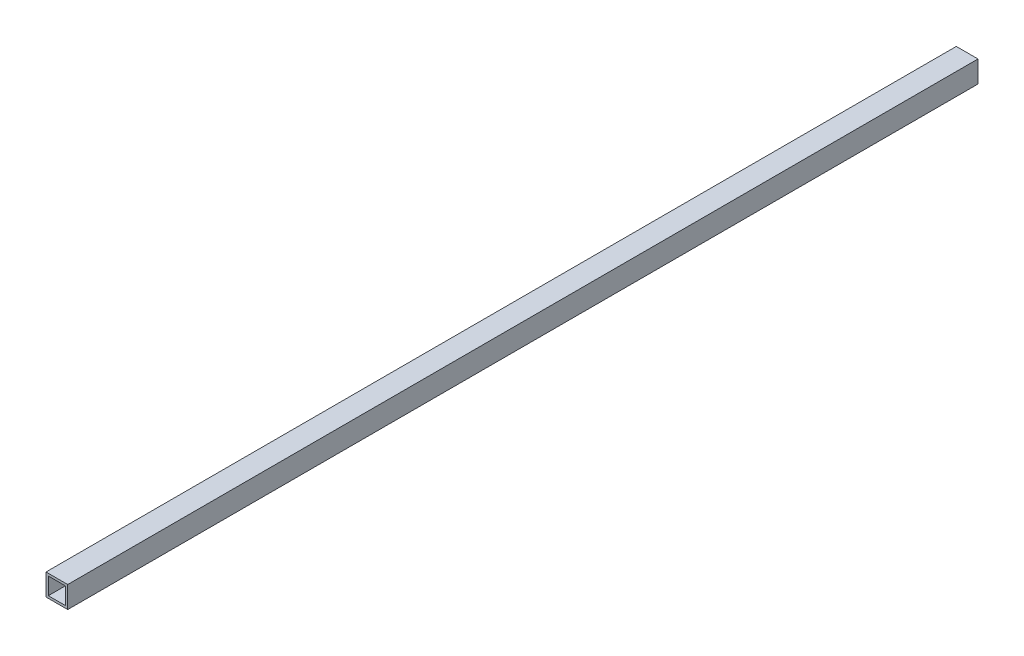
ISO-10303-21;
HEADER;
FILE_DESCRIPTION(('STEP AP214'),'2;1');
FILE_NAME('part.step','',(''),(''),'','','');
FILE_SCHEMA(('AUTOMOTIVE_DESIGN { 1 0 10303 214 1 1 1 1 }'));
ENDSEC;
DATA;
#1=APPLICATION_CONTEXT('core data for automotive mechanical design processes');
#2=APPLICATION_PROTOCOL_DEFINITION('international standard','automotive_design',2000,#1);
#3=PRODUCT_CONTEXT('',#1,'mechanical');
#4=PRODUCT('Part','Part','',(#3));
#5=PRODUCT_RELATED_PRODUCT_CATEGORY('part','',(#4));
#6=PRODUCT_DEFINITION_FORMATION('','',#4);
#7=PRODUCT_DEFINITION_CONTEXT('part definition',#1,'design');
#8=PRODUCT_DEFINITION('design','',#6,#7);
#9=PRODUCT_DEFINITION_SHAPE('','',#8);
#10=(LENGTH_UNIT() NAMED_UNIT(*) SI_UNIT(.MILLI.,.METRE.));
#11=(NAMED_UNIT(*) PLANE_ANGLE_UNIT() SI_UNIT($,.RADIAN.));
#12=(NAMED_UNIT(*) SI_UNIT($,.STERADIAN.) SOLID_ANGLE_UNIT());
#13=UNCERTAINTY_MEASURE_WITH_UNIT(LENGTH_MEASURE(1.E-05),#10,'distance_accuracy_value','');
#14=(GEOMETRIC_REPRESENTATION_CONTEXT(3) GLOBAL_UNCERTAINTY_ASSIGNED_CONTEXT((#13)) GLOBAL_UNIT_ASSIGNED_CONTEXT((#10,
#11,#12)) REPRESENTATION_CONTEXT('',''));
#15=CARTESIAN_POINT('',(0.,0.,0.));
#16=DIRECTION('',(0.,0.,1.));
#17=DIRECTION('',(1.,0.,0.));
#18=AXIS2_PLACEMENT_3D('',#15,#16,#17);
#19=CARTESIAN_POINT('',(0.,0.,587.));
#20=DIRECTION('',(0.,0.,1.));
#21=DIRECTION('',(1.,0.,0.));
#22=AXIS2_PLACEMENT_3D('',#19,#20,#21);
#23=PLANE('',#22);
#24=DIRECTION('',(0.,1.,0.));
#25=VECTOR('',#24,1.);
#26=CARTESIAN_POINT('',(7.,5.5,587.));
#27=LINE('',#26,#25);
#28=CARTESIAN_POINT('',(7.,-7.,587.));
#29=VERTEX_POINT('',#28);
#30=CARTESIAN_POINT('',(7.,7.,587.));
#31=VERTEX_POINT('',#30);
#32=EDGE_CURVE('E158',#29,#31,#27,.T.);
#33=ORIENTED_EDGE('',*,*,#32,.T.);
#34=DIRECTION('',(-1.,0.,0.));
#35=VECTOR('',#34,1.);
#36=CARTESIAN_POINT('',(-5.5,7.,587.));
#37=LINE('',#36,#35);
#38=CARTESIAN_POINT('',(-7.,7.,587.));
#39=VERTEX_POINT('',#38);
#40=EDGE_CURVE('E161',#31,#39,#37,.T.);
#41=ORIENTED_EDGE('',*,*,#40,.T.);
#42=DIRECTION('',(0.,-1.,0.));
#43=VECTOR('',#42,1.);
#44=CARTESIAN_POINT('',(-7.,5.5,587.));
#45=LINE('',#44,#43);
#46=CARTESIAN_POINT('',(-7.,-7.,587.));
#47=VERTEX_POINT('',#46);
#48=EDGE_CURVE('E164',#39,#47,#45,.T.);
#49=ORIENTED_EDGE('',*,*,#48,.T.);
#50=DIRECTION('',(1.,0.,0.));
#51=VECTOR('',#50,1.);
#52=CARTESIAN_POINT('',(-5.5,-7.,587.));
#53=LINE('',#52,#51);
#54=EDGE_CURVE('E166',#47,#29,#53,.T.);
#55=ORIENTED_EDGE('',*,*,#54,.T.);
#56=EDGE_LOOP('',(#33,#41,#49,#55));
#57=FACE_BOUND('',#56,.T.);
#58=DIRECTION('',(-1.,0.,0.));
#59=VECTOR('',#58,1.);
#60=CARTESIAN_POINT('',(-5.5,5.5,587.));
#61=LINE('',#60,#59);
#62=CARTESIAN_POINT('',(5.5,5.5,587.));
#63=VERTEX_POINT('',#62);
#64=CARTESIAN_POINT('',(-5.5,5.5,587.));
#65=VERTEX_POINT('',#64);
#66=EDGE_CURVE('E130',#63,#65,#61,.T.);
#67=ORIENTED_EDGE('',*,*,#66,.F.);
#68=DIRECTION('',(0.,1.,0.));
#69=VECTOR('',#68,1.);
#70=CARTESIAN_POINT('',(5.5,5.5,587.));
#71=LINE('',#70,#69);
#72=CARTESIAN_POINT('',(5.5,-5.5,587.));
#73=VERTEX_POINT('',#72);
#74=EDGE_CURVE('E122',#73,#63,#71,.T.);
#75=ORIENTED_EDGE('',*,*,#74,.F.);
#76=DIRECTION('',(1.,0.,0.));
#77=VECTOR('',#76,1.);
#78=CARTESIAN_POINT('',(-5.5,-5.5,587.));
#79=LINE('',#78,#77);
#80=CARTESIAN_POINT('',(-5.5,-5.5,587.));
#81=VERTEX_POINT('',#80);
#82=EDGE_CURVE('E144',#81,#73,#79,.T.);
#83=ORIENTED_EDGE('',*,*,#82,.F.);
#84=DIRECTION('',(0.,-1.,0.));
#85=VECTOR('',#84,1.);
#86=CARTESIAN_POINT('',(-5.5,5.5,587.));
#87=LINE('',#86,#85);
#88=EDGE_CURVE('E142',#65,#81,#87,.T.);
#89=ORIENTED_EDGE('',*,*,#88,.F.);
#90=EDGE_LOOP('',(#67,#75,#83,#89));
#91=FACE_BOUND('',#90,.T.);
#92=ADVANCED_FACE('F57',(#57,#91),#23,.T.);
#93=CARTESIAN_POINT('',(0.,0.,0.));
#94=DIRECTION('',(0.,0.,1.));
#95=DIRECTION('',(1.,0.,0.));
#96=AXIS2_PLACEMENT_3D('',#93,#94,#95);
#97=PLANE('',#96);
#98=DIRECTION('',(0.,1.,0.));
#99=VECTOR('',#98,1.);
#100=CARTESIAN_POINT('',(7.,5.5,0.));
#101=LINE('',#100,#99);
#102=CARTESIAN_POINT('',(7.,-7.,0.));
#103=VERTEX_POINT('',#102);
#104=CARTESIAN_POINT('',(7.,7.,0.));
#105=VERTEX_POINT('',#104);
#106=EDGE_CURVE('E138',#103,#105,#101,.T.);
#107=ORIENTED_EDGE('',*,*,#106,.F.);
#108=DIRECTION('',(1.,0.,0.));
#109=VECTOR('',#108,1.);
#110=CARTESIAN_POINT('',(-5.5,-7.,0.));
#111=LINE('',#110,#109);
#112=CARTESIAN_POINT('',(-7.,-7.,0.));
#113=VERTEX_POINT('',#112);
#114=EDGE_CURVE('E162',#113,#103,#111,.T.);
#115=ORIENTED_EDGE('',*,*,#114,.F.);
#116=DIRECTION('',(0.,-1.,0.));
#117=VECTOR('',#116,1.);
#118=CARTESIAN_POINT('',(-7.,5.5,0.));
#119=LINE('',#118,#117);
#120=CARTESIAN_POINT('',(-7.,7.,0.));
#121=VERTEX_POINT('',#120);
#122=EDGE_CURVE('E173',#121,#113,#119,.T.);
#123=ORIENTED_EDGE('',*,*,#122,.F.);
#124=DIRECTION('',(-1.,0.,0.));
#125=VECTOR('',#124,1.);
#126=CARTESIAN_POINT('',(-5.5,7.,0.));
#127=LINE('',#126,#125);
#128=EDGE_CURVE('E171',#105,#121,#127,.T.);
#129=ORIENTED_EDGE('',*,*,#128,.F.);
#130=EDGE_LOOP('',(#107,#115,#123,#129));
#131=FACE_BOUND('',#130,.T.);
#132=DIRECTION('',(0.,1.,0.));
#133=VECTOR('',#132,1.);
#134=CARTESIAN_POINT('',(5.5,5.5,0.));
#135=LINE('',#134,#133);
#136=CARTESIAN_POINT('',(5.5,-5.5,0.));
#137=VERTEX_POINT('',#136);
#138=CARTESIAN_POINT('',(5.5,5.5,0.));
#139=VERTEX_POINT('',#138);
#140=EDGE_CURVE('E80',#137,#139,#135,.T.);
#141=ORIENTED_EDGE('',*,*,#140,.T.);
#142=DIRECTION('',(-1.,0.,0.));
#143=VECTOR('',#142,1.);
#144=CARTESIAN_POINT('',(-5.5,5.5,0.));
#145=LINE('',#144,#143);
#146=CARTESIAN_POINT('',(-5.5,5.5,0.));
#147=VERTEX_POINT('',#146);
#148=EDGE_CURVE('E137',#139,#147,#145,.T.);
#149=ORIENTED_EDGE('',*,*,#148,.T.);
#150=DIRECTION('',(0.,-1.,0.));
#151=VECTOR('',#150,1.);
#152=CARTESIAN_POINT('',(-5.5,5.5,0.));
#153=LINE('',#152,#151);
#154=CARTESIAN_POINT('',(-5.5,-5.5,0.));
#155=VERTEX_POINT('',#154);
#156=EDGE_CURVE('E150',#147,#155,#153,.T.);
#157=ORIENTED_EDGE('',*,*,#156,.T.);
#158=DIRECTION('',(1.,0.,0.));
#159=VECTOR('',#158,1.);
#160=CARTESIAN_POINT('',(-5.5,-5.5,0.));
#161=LINE('',#160,#159);
#162=EDGE_CURVE('E131',#155,#137,#161,.T.);
#163=ORIENTED_EDGE('',*,*,#162,.T.);
#164=EDGE_LOOP('',(#141,#149,#157,#163));
#165=FACE_BOUND('',#164,.T.);
#166=ADVANCED_FACE('F191',(#131,#165),#97,.F.);
#167=CARTESIAN_POINT('',(7.,5.5,587.));
#168=DIRECTION('',(-1.,0.,0.));
#169=DIRECTION('',(0.,-1.,0.));
#170=AXIS2_PLACEMENT_3D('',#167,#168,#169);
#171=PLANE('',#170);
#172=ORIENTED_EDGE('',*,*,#106,.T.);
#173=DIRECTION('',(0.,0.,-1.));
#174=VECTOR('',#173,1.);
#175=CARTESIAN_POINT('',(7.,7.,587.));
#176=LINE('',#175,#174);
#177=EDGE_CURVE('E12',#31,#105,#176,.T.);
#178=ORIENTED_EDGE('',*,*,#177,.F.);
#179=ORIENTED_EDGE('',*,*,#32,.F.);
#180=DIRECTION('',(0.,0.,-1.));
#181=VECTOR('',#180,1.);
#182=CARTESIAN_POINT('',(7.,-7.,587.));
#183=LINE('',#182,#181);
#184=EDGE_CURVE('E168',#29,#103,#183,.T.);
#185=ORIENTED_EDGE('',*,*,#184,.T.);
#186=EDGE_LOOP('',(#172,#178,#179,#185));
#187=FACE_BOUND('',#186,.T.);
#188=ADVANCED_FACE('F59',(#187),#171,.F.);
#189=CARTESIAN_POINT('',(-5.5,7.,587.));
#190=DIRECTION('',(0.,-1.,0.));
#191=DIRECTION('',(0.,0.,-1.));
#192=AXIS2_PLACEMENT_3D('',#189,#190,#191);
#193=PLANE('',#192);
#194=ORIENTED_EDGE('',*,*,#128,.T.);
#195=DIRECTION('',(0.,0.,-1.));
#196=VECTOR('',#195,1.);
#197=CARTESIAN_POINT('',(-7.,7.,587.));
#198=LINE('',#197,#196);
#199=EDGE_CURVE('E65',#39,#121,#198,.T.);
#200=ORIENTED_EDGE('',*,*,#199,.F.);
#201=ORIENTED_EDGE('',*,*,#40,.F.);
#202=ORIENTED_EDGE('',*,*,#177,.T.);
#203=EDGE_LOOP('',(#194,#200,#201,#202));
#204=FACE_BOUND('',#203,.T.);
#205=ADVANCED_FACE('F201',(#204),#193,.F.);
#206=CARTESIAN_POINT('',(-7.,5.5,587.));
#207=DIRECTION('',(1.,0.,0.));
#208=DIRECTION('',(0.,1.,0.));
#209=AXIS2_PLACEMENT_3D('',#206,#207,#208);
#210=PLANE('',#209);
#211=ORIENTED_EDGE('',*,*,#122,.T.);
#212=DIRECTION('',(0.,0.,-1.));
#213=VECTOR('',#212,1.);
#214=CARTESIAN_POINT('',(-7.,-7.,587.));
#215=LINE('',#214,#213);
#216=EDGE_CURVE('E178',#47,#113,#215,.T.);
#217=ORIENTED_EDGE('',*,*,#216,.F.);
#218=ORIENTED_EDGE('',*,*,#48,.F.);
#219=ORIENTED_EDGE('',*,*,#199,.T.);
#220=EDGE_LOOP('',(#211,#217,#218,#219));
#221=FACE_BOUND('',#220,.T.);
#222=ADVANCED_FACE('F185',(#221),#210,.F.);
#223=CARTESIAN_POINT('',(-5.5,-7.,587.));
#224=DIRECTION('',(0.,1.,0.));
#225=DIRECTION('',(0.,0.,1.));
#226=AXIS2_PLACEMENT_3D('',#223,#224,#225);
#227=PLANE('',#226);
#228=ORIENTED_EDGE('',*,*,#114,.T.);
#229=ORIENTED_EDGE('',*,*,#184,.F.);
#230=ORIENTED_EDGE('',*,*,#54,.F.);
#231=ORIENTED_EDGE('',*,*,#216,.T.);
#232=EDGE_LOOP('',(#228,#229,#230,#231));
#233=FACE_BOUND('',#232,.T.);
#234=ADVANCED_FACE('F195',(#233),#227,.F.);
#235=CARTESIAN_POINT('',(5.5,5.5,587.));
#236=DIRECTION('',(-1.,0.,0.));
#237=DIRECTION('',(0.,-1.,0.));
#238=AXIS2_PLACEMENT_3D('',#235,#236,#237);
#239=PLANE('',#238);
#240=ORIENTED_EDGE('',*,*,#140,.F.);
#241=DIRECTION('',(0.,0.,-1.));
#242=VECTOR('',#241,1.);
#243=CARTESIAN_POINT('',(5.5,-5.5,587.));
#244=LINE('',#243,#242);
#245=EDGE_CURVE('E126',#73,#137,#244,.T.);
#246=ORIENTED_EDGE('',*,*,#245,.F.);
#247=ORIENTED_EDGE('',*,*,#74,.T.);
#248=DIRECTION('',(0.,0.,-1.));
#249=VECTOR('',#248,1.);
#250=CARTESIAN_POINT('',(5.5,5.5,587.));
#251=LINE('',#250,#249);
#252=EDGE_CURVE('E125',#63,#139,#251,.T.);
#253=ORIENTED_EDGE('',*,*,#252,.T.);
#254=EDGE_LOOP('',(#240,#246,#247,#253));
#255=FACE_BOUND('',#254,.T.);
#256=ADVANCED_FACE('F124',(#255),#239,.T.);
#257=CARTESIAN_POINT('',(-5.5,5.5,587.));
#258=DIRECTION('',(0.,-1.,0.));
#259=DIRECTION('',(0.,0.,-1.));
#260=AXIS2_PLACEMENT_3D('',#257,#258,#259);
#261=PLANE('',#260);
#262=ORIENTED_EDGE('',*,*,#148,.F.);
#263=ORIENTED_EDGE('',*,*,#252,.F.);
#264=ORIENTED_EDGE('',*,*,#66,.T.);
#265=DIRECTION('',(0.,0.,-1.));
#266=VECTOR('',#265,1.);
#267=CARTESIAN_POINT('',(-5.5,5.5,587.));
#268=LINE('',#267,#266);
#269=EDGE_CURVE('E139',#65,#147,#268,.T.);
#270=ORIENTED_EDGE('',*,*,#269,.T.);
#271=EDGE_LOOP('',(#262,#263,#264,#270));
#272=FACE_BOUND('',#271,.T.);
#273=ADVANCED_FACE('F134',(#272),#261,.T.);
#274=CARTESIAN_POINT('',(-5.5,5.5,587.));
#275=DIRECTION('',(1.,0.,0.));
#276=DIRECTION('',(0.,1.,0.));
#277=AXIS2_PLACEMENT_3D('',#274,#275,#276);
#278=PLANE('',#277);
#279=ORIENTED_EDGE('',*,*,#156,.F.);
#280=ORIENTED_EDGE('',*,*,#269,.F.);
#281=ORIENTED_EDGE('',*,*,#88,.T.);
#282=DIRECTION('',(0.,0.,-1.));
#283=VECTOR('',#282,1.);
#284=CARTESIAN_POINT('',(-5.5,-5.5,587.));
#285=LINE('',#284,#283);
#286=EDGE_CURVE('E72',#81,#155,#285,.T.);
#287=ORIENTED_EDGE('',*,*,#286,.T.);
#288=EDGE_LOOP('',(#279,#280,#281,#287));
#289=FACE_BOUND('',#288,.T.);
#290=ADVANCED_FACE('F224',(#289),#278,.T.);
#291=CARTESIAN_POINT('',(-5.5,-5.5,587.));
#292=DIRECTION('',(0.,1.,0.));
#293=DIRECTION('',(0.,0.,1.));
#294=AXIS2_PLACEMENT_3D('',#291,#292,#293);
#295=PLANE('',#294);
#296=ORIENTED_EDGE('',*,*,#162,.F.);
#297=ORIENTED_EDGE('',*,*,#286,.F.);
#298=ORIENTED_EDGE('',*,*,#82,.T.);
#299=ORIENTED_EDGE('',*,*,#245,.T.);
#300=EDGE_LOOP('',(#296,#297,#298,#299));
#301=FACE_BOUND('',#300,.T.);
#302=ADVANCED_FACE('F228',(#301),#295,.T.);
#303=CLOSED_SHELL('',(#92,#166,#188,#205,#222,#234,#256,#273,#290,#302));
#304=MANIFOLD_SOLID_BREP('B2',#303);
#305=ADVANCED_BREP_SHAPE_REPRESENTATION('',(#18,#304),#14);
#306=SHAPE_DEFINITION_REPRESENTATION(#9,#305);
ENDSEC;
END-ISO-10303-21;
